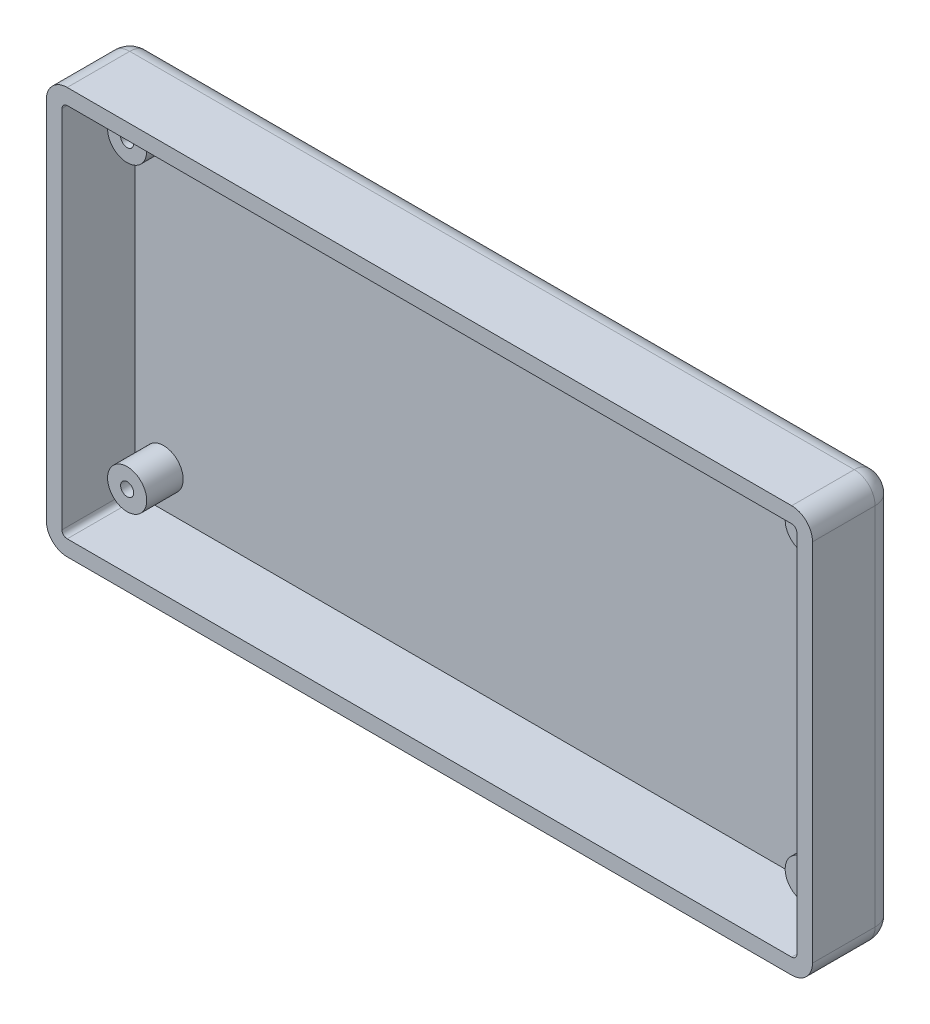
ISO-10303-21;
HEADER;
FILE_DESCRIPTION(('STEP AP214'),'2;1');
FILE_NAME('part.step','',(''),(''),'','','');
FILE_SCHEMA(('AUTOMOTIVE_DESIGN { 1 0 10303 214 1 1 1 1 }'));
ENDSEC;
DATA;
#1=APPLICATION_CONTEXT('core data for automotive mechanical design processes');
#2=APPLICATION_PROTOCOL_DEFINITION('international standard','automotive_design',2000,#1);
#3=PRODUCT_CONTEXT('',#1,'mechanical');
#4=PRODUCT('Part','Part','',(#3));
#5=PRODUCT_RELATED_PRODUCT_CATEGORY('part','',(#4));
#6=PRODUCT_DEFINITION_FORMATION('','',#4);
#7=PRODUCT_DEFINITION_CONTEXT('part definition',#1,'design');
#8=PRODUCT_DEFINITION('design','',#6,#7);
#9=PRODUCT_DEFINITION_SHAPE('','',#8);
#10=(LENGTH_UNIT() NAMED_UNIT(*) SI_UNIT(.MILLI.,.METRE.));
#11=(NAMED_UNIT(*) PLANE_ANGLE_UNIT() SI_UNIT($,.RADIAN.));
#12=(NAMED_UNIT(*) SI_UNIT($,.STERADIAN.) SOLID_ANGLE_UNIT());
#13=UNCERTAINTY_MEASURE_WITH_UNIT(LENGTH_MEASURE(1.E-05),#10,'distance_accuracy_value','');
#14=(GEOMETRIC_REPRESENTATION_CONTEXT(3) GLOBAL_UNCERTAINTY_ASSIGNED_CONTEXT((#13)) GLOBAL_UNIT_ASSIGNED_CONTEXT((#10,
#11,#12)) REPRESENTATION_CONTEXT('',''));
#15=CARTESIAN_POINT('',(0.,0.,0.));
#16=DIRECTION('',(0.,0.,1.));
#17=DIRECTION('',(1.,0.,0.));
#18=AXIS2_PLACEMENT_3D('',#15,#16,#17);
#19=CARTESIAN_POINT('',(0.,0.,2.));
#20=DIRECTION('',(0.,0.,1.));
#21=DIRECTION('',(1.,0.,0.));
#22=AXIS2_PLACEMENT_3D('',#19,#20,#21);
#23=PLANE('',#22);
#24=CARTESIAN_POINT('',(-69.5,35.,2.));
#25=DIRECTION('',(0.,0.,1.));
#26=DIRECTION('',(1.,0.,0.));
#27=AXIS2_PLACEMENT_3D('',#24,#25,#26);
#28=CIRCLE('',#27,1.);
#29=CARTESIAN_POINT('',(-70.5,35.,2.));
#30=VERTEX_POINT('',#29);
#31=CARTESIAN_POINT('',(-69.5,36.,2.));
#32=VERTEX_POINT('',#31);
#33=EDGE_CURVE('E218',#30,#32,#28,.F.);
#34=ORIENTED_EDGE('',*,*,#33,.F.);
#35=DIRECTION('',(0.,1.,0.));
#36=VECTOR('',#35,1.);
#37=CARTESIAN_POINT('',(-70.5,35.,2.));
#38=LINE('',#37,#36);
#39=CARTESIAN_POINT('',(-70.5,-35.,2.));
#40=VERTEX_POINT('',#39);
#41=EDGE_CURVE('E215',#40,#30,#38,.T.);
#42=ORIENTED_EDGE('',*,*,#41,.F.);
#43=CARTESIAN_POINT('',(-69.5,-35.,2.));
#44=DIRECTION('',(0.,0.,1.));
#45=DIRECTION('',(1.,0.,0.));
#46=AXIS2_PLACEMENT_3D('',#43,#44,#45);
#47=CIRCLE('',#46,1.);
#48=CARTESIAN_POINT('',(-69.5,-36.,2.));
#49=VERTEX_POINT('',#48);
#50=EDGE_CURVE('E171',#49,#40,#47,.F.);
#51=ORIENTED_EDGE('',*,*,#50,.F.);
#52=DIRECTION('',(-1.,0.,0.));
#53=VECTOR('',#52,1.);
#54=CARTESIAN_POINT('',(-69.5,-36.,2.));
#55=LINE('',#54,#53);
#56=CARTESIAN_POINT('',(69.5,-36.,2.));
#57=VERTEX_POINT('',#56);
#58=EDGE_CURVE('E399',#57,#49,#55,.T.);
#59=ORIENTED_EDGE('',*,*,#58,.F.);
#60=CARTESIAN_POINT('',(69.5,-35.,2.));
#61=DIRECTION('',(0.,0.,1.));
#62=DIRECTION('',(1.,0.,0.));
#63=AXIS2_PLACEMENT_3D('',#60,#61,#62);
#64=CIRCLE('',#63,0.999999999999994);
#65=CARTESIAN_POINT('',(70.5,-35.,2.));
#66=VERTEX_POINT('',#65);
#67=EDGE_CURVE('E401',#66,#57,#64,.F.);
#68=ORIENTED_EDGE('',*,*,#67,.F.);
#69=DIRECTION('',(0.,-1.,0.));
#70=VECTOR('',#69,1.);
#71=CARTESIAN_POINT('',(70.5,-35.,2.));
#72=LINE('',#71,#70);
#73=CARTESIAN_POINT('',(70.5,35.,2.));
#74=VERTEX_POINT('',#73);
#75=EDGE_CURVE('E403',#74,#66,#72,.T.);
#76=ORIENTED_EDGE('',*,*,#75,.F.);
#77=CARTESIAN_POINT('',(69.5,35.,2.));
#78=DIRECTION('',(0.,0.,1.));
#79=DIRECTION('',(1.,0.,0.));
#80=AXIS2_PLACEMENT_3D('',#77,#78,#79);
#81=CIRCLE('',#80,1.);
#82=CARTESIAN_POINT('',(69.5,36.,2.));
#83=VERTEX_POINT('',#82);
#84=EDGE_CURVE('E405',#83,#74,#81,.F.);
#85=ORIENTED_EDGE('',*,*,#84,.F.);
#86=DIRECTION('',(1.,0.,0.));
#87=VECTOR('',#86,1.);
#88=CARTESIAN_POINT('',(69.5,36.,2.));
#89=LINE('',#88,#87);
#90=EDGE_CURVE('E407',#32,#83,#89,.T.);
#91=ORIENTED_EDGE('',*,*,#90,.F.);
#92=EDGE_LOOP('',(#34,#42,#51,#59,#68,#76,#85,#91));
#93=FACE_BOUND('',#92,.T.);
#94=CARTESIAN_POINT('',(-65.,29.,2.));
#95=DIRECTION('',(0.,0.,1.));
#96=DIRECTION('',(1.,0.,0.));
#97=AXIS2_PLACEMENT_3D('',#94,#95,#96);
#98=CIRCLE('',#97,3.75000000000001);
#99=CARTESIAN_POINT('',(-61.25,29.,2.));
#100=VERTEX_POINT('',#99);
#101=EDGE_CURVE('E387',#100,#100,#98,.T.);
#102=ORIENTED_EDGE('',*,*,#101,.F.);
#103=EDGE_LOOP('',(#102));
#104=FACE_BOUND('',#103,.T.);
#105=CARTESIAN_POINT('',(65.,29.,2.));
#106=DIRECTION('',(0.,0.,1.));
#107=DIRECTION('',(-1.,0.,0.));
#108=AXIS2_PLACEMENT_3D('',#105,#106,#107);
#109=CIRCLE('',#108,3.75000000000001);
#110=CARTESIAN_POINT('',(61.25,29.,2.));
#111=VERTEX_POINT('',#110);
#112=EDGE_CURVE('E393',#111,#111,#109,.T.);
#113=ORIENTED_EDGE('',*,*,#112,.F.);
#114=EDGE_LOOP('',(#113));
#115=FACE_BOUND('',#114,.T.);
#116=CARTESIAN_POINT('',(65.,-29.,2.));
#117=DIRECTION('',(0.,0.,1.));
#118=DIRECTION('',(1.,0.,0.));
#119=AXIS2_PLACEMENT_3D('',#116,#117,#118);
#120=CIRCLE('',#119,3.75000000000001);
#121=CARTESIAN_POINT('',(68.75,-29.,2.));
#122=VERTEX_POINT('',#121);
#123=EDGE_CURVE('E810',#122,#122,#120,.T.);
#124=ORIENTED_EDGE('',*,*,#123,.F.);
#125=EDGE_LOOP('',(#124));
#126=FACE_BOUND('',#125,.T.);
#127=CARTESIAN_POINT('',(-65.,-29.,2.));
#128=DIRECTION('',(0.,0.,1.));
#129=DIRECTION('',(-1.,0.,0.));
#130=AXIS2_PLACEMENT_3D('',#127,#128,#129);
#131=CIRCLE('',#130,3.75000000000001);
#132=CARTESIAN_POINT('',(-68.75,-29.,2.));
#133=VERTEX_POINT('',#132);
#134=EDGE_CURVE('E799',#133,#133,#131,.T.);
#135=ORIENTED_EDGE('',*,*,#134,.F.);
#136=EDGE_LOOP('',(#135));
#137=FACE_BOUND('',#136,.T.);
#138=ADVANCED_FACE('F36',(#93,#104,#115,#126,#137),#23,.T.);
#139=CARTESIAN_POINT('',(73.5,39.,16.));
#140=DIRECTION('',(-1.,0.,0.));
#141=DIRECTION('',(0.,0.,1.));
#142=AXIS2_PLACEMENT_3D('',#139,#140,#141);
#143=PLANE('',#142);
#144=DIRECTION('',(0.,0.,-1.));
#145=VECTOR('',#144,1.);
#146=CARTESIAN_POINT('',(73.5,-35.,16.));
#147=LINE('',#146,#145);
#148=CARTESIAN_POINT('',(73.5,-35.,16.));
#149=VERTEX_POINT('',#148);
#150=CARTESIAN_POINT('',(73.5,-35.,4.));
#151=VERTEX_POINT('',#150);
#152=EDGE_CURVE('E251',#149,#151,#147,.T.);
#153=ORIENTED_EDGE('',*,*,#152,.T.);
#154=DIRECTION('',(0.,1.,0.));
#155=VECTOR('',#154,1.);
#156=CARTESIAN_POINT('',(73.5,39.,4.));
#157=LINE('',#156,#155);
#158=CARTESIAN_POINT('',(73.5,35.,4.));
#159=VERTEX_POINT('',#158);
#160=EDGE_CURVE('E275',#151,#159,#157,.T.);
#161=ORIENTED_EDGE('',*,*,#160,.T.);
#162=DIRECTION('',(0.,0.,-1.));
#163=VECTOR('',#162,1.);
#164=CARTESIAN_POINT('',(73.5,35.,16.));
#165=LINE('',#164,#163);
#166=CARTESIAN_POINT('',(73.5,35.,16.));
#167=VERTEX_POINT('',#166);
#168=EDGE_CURVE('E249',#159,#167,#165,.F.);
#169=ORIENTED_EDGE('',*,*,#168,.T.);
#170=DIRECTION('',(0.,1.,0.));
#171=VECTOR('',#170,1.);
#172=CARTESIAN_POINT('',(73.5,39.,16.));
#173=LINE('',#172,#171);
#174=EDGE_CURVE('E219',#149,#167,#173,.T.);
#175=ORIENTED_EDGE('',*,*,#174,.F.);
#176=EDGE_LOOP('',(#153,#161,#169,#175));
#177=FACE_BOUND('',#176,.T.);
#178=ADVANCED_FACE('F341',(#177),#143,.F.);
#179=CARTESIAN_POINT('',(-73.5,39.,16.));
#180=DIRECTION('',(0.,-1.,0.));
#181=DIRECTION('',(0.,0.,-1.));
#182=AXIS2_PLACEMENT_3D('',#179,#180,#181);
#183=PLANE('',#182);
#184=DIRECTION('',(0.,0.,-1.));
#185=VECTOR('',#184,1.);
#186=CARTESIAN_POINT('',(69.5,39.,16.));
#187=LINE('',#186,#185);
#188=CARTESIAN_POINT('',(69.5,39.,16.));
#189=VERTEX_POINT('',#188);
#190=CARTESIAN_POINT('',(69.5,39.,4.));
#191=VERTEX_POINT('',#190);
#192=EDGE_CURVE('E256',#189,#191,#187,.T.);
#193=ORIENTED_EDGE('',*,*,#192,.T.);
#194=DIRECTION('',(-1.,0.,0.));
#195=VECTOR('',#194,1.);
#196=CARTESIAN_POINT('',(-73.5,39.,4.));
#197=LINE('',#196,#195);
#198=CARTESIAN_POINT('',(-69.5,39.,4.));
#199=VERTEX_POINT('',#198);
#200=EDGE_CURVE('E262',#191,#199,#197,.T.);
#201=ORIENTED_EDGE('',*,*,#200,.T.);
#202=DIRECTION('',(0.,0.,-1.));
#203=VECTOR('',#202,1.);
#204=CARTESIAN_POINT('',(-69.5,39.,16.));
#205=LINE('',#204,#203);
#206=CARTESIAN_POINT('',(-69.5,39.,16.));
#207=VERTEX_POINT('',#206);
#208=EDGE_CURVE('E254',#199,#207,#205,.F.);
#209=ORIENTED_EDGE('',*,*,#208,.T.);
#210=DIRECTION('',(-1.,0.,0.));
#211=VECTOR('',#210,1.);
#212=CARTESIAN_POINT('',(-73.5,39.,16.));
#213=LINE('',#212,#211);
#214=EDGE_CURVE('E222',#189,#207,#213,.T.);
#215=ORIENTED_EDGE('',*,*,#214,.F.);
#216=EDGE_LOOP('',(#193,#201,#209,#215));
#217=FACE_BOUND('',#216,.T.);
#218=ADVANCED_FACE('F346',(#217),#183,.F.);
#219=CARTESIAN_POINT('',(-73.5,39.,16.));
#220=DIRECTION('',(1.,0.,0.));
#221=DIRECTION('',(0.,1.,0.));
#222=AXIS2_PLACEMENT_3D('',#219,#220,#221);
#223=PLANE('',#222);
#224=DIRECTION('',(0.,0.,-1.));
#225=VECTOR('',#224,1.);
#226=CARTESIAN_POINT('',(-73.5,35.,16.));
#227=LINE('',#226,#225);
#228=CARTESIAN_POINT('',(-73.5,35.,16.));
#229=VERTEX_POINT('',#228);
#230=CARTESIAN_POINT('',(-73.5,35.,4.));
#231=VERTEX_POINT('',#230);
#232=EDGE_CURVE('E237',#229,#231,#227,.T.);
#233=ORIENTED_EDGE('',*,*,#232,.T.);
#234=DIRECTION('',(0.,-1.,0.));
#235=VECTOR('',#234,1.);
#236=CARTESIAN_POINT('',(-73.5,39.,4.));
#237=LINE('',#236,#235);
#238=CARTESIAN_POINT('',(-73.5,-35.,4.));
#239=VERTEX_POINT('',#238);
#240=EDGE_CURVE('E59',#231,#239,#237,.T.);
#241=ORIENTED_EDGE('',*,*,#240,.T.);
#242=DIRECTION('',(0.,0.,-1.));
#243=VECTOR('',#242,1.);
#244=CARTESIAN_POINT('',(-73.5,-35.,16.));
#245=LINE('',#244,#243);
#246=CARTESIAN_POINT('',(-73.5,-35.,16.));
#247=VERTEX_POINT('',#246);
#248=EDGE_CURVE('E239',#239,#247,#245,.F.);
#249=ORIENTED_EDGE('',*,*,#248,.T.);
#250=DIRECTION('',(0.,-1.,0.));
#251=VECTOR('',#250,1.);
#252=CARTESIAN_POINT('',(-73.5,39.,16.));
#253=LINE('',#252,#251);
#254=EDGE_CURVE('E226',#229,#247,#253,.T.);
#255=ORIENTED_EDGE('',*,*,#254,.F.);
#256=EDGE_LOOP('',(#233,#241,#249,#255));
#257=FACE_BOUND('',#256,.T.);
#258=ADVANCED_FACE('F456',(#257),#223,.F.);
#259=CARTESIAN_POINT('',(-73.5,-39.,16.));
#260=DIRECTION('',(0.,1.,0.));
#261=DIRECTION('',(0.,0.,1.));
#262=AXIS2_PLACEMENT_3D('',#259,#260,#261);
#263=PLANE('',#262);
#264=DIRECTION('',(0.,0.,-1.));
#265=VECTOR('',#264,1.);
#266=CARTESIAN_POINT('',(-69.5,-39.,16.));
#267=LINE('',#266,#265);
#268=CARTESIAN_POINT('',(-69.5,-39.,16.));
#269=VERTEX_POINT('',#268);
#270=CARTESIAN_POINT('',(-69.5,-39.,4.));
#271=VERTEX_POINT('',#270);
#272=EDGE_CURVE('E234',#269,#271,#267,.T.);
#273=ORIENTED_EDGE('',*,*,#272,.T.);
#274=DIRECTION('',(1.,0.,0.));
#275=VECTOR('',#274,1.);
#276=CARTESIAN_POINT('',(-73.5,-39.,4.));
#277=LINE('',#276,#275);
#278=CARTESIAN_POINT('',(69.5,-39.,4.));
#279=VERTEX_POINT('',#278);
#280=EDGE_CURVE('E279',#271,#279,#277,.T.);
#281=ORIENTED_EDGE('',*,*,#280,.T.);
#282=DIRECTION('',(0.,0.,-1.));
#283=VECTOR('',#282,1.);
#284=CARTESIAN_POINT('',(69.5,-39.,16.));
#285=LINE('',#284,#283);
#286=CARTESIAN_POINT('',(69.5,-39.,16.));
#287=VERTEX_POINT('',#286);
#288=EDGE_CURVE('E232',#279,#287,#285,.F.);
#289=ORIENTED_EDGE('',*,*,#288,.T.);
#290=DIRECTION('',(1.,0.,0.));
#291=VECTOR('',#290,1.);
#292=CARTESIAN_POINT('',(-73.5,-39.,16.));
#293=LINE('',#292,#291);
#294=EDGE_CURVE('E229',#269,#287,#293,.T.);
#295=ORIENTED_EDGE('',*,*,#294,.F.);
#296=EDGE_LOOP('',(#273,#281,#289,#295));
#297=FACE_BOUND('',#296,.T.);
#298=ADVANCED_FACE('F449',(#297),#263,.F.);
#299=CARTESIAN_POINT('',(0.,0.,16.));
#300=DIRECTION('',(0.,0.,1.));
#301=DIRECTION('',(1.,0.,0.));
#302=AXIS2_PLACEMENT_3D('',#299,#300,#301);
#303=PLANE('',#302);
#304=CARTESIAN_POINT('',(-69.5,35.,16.));
#305=DIRECTION('',(0.,0.,1.));
#306=DIRECTION('',(1.,0.,0.));
#307=AXIS2_PLACEMENT_3D('',#304,#305,#306);
#308=CIRCLE('',#307,1.);
#309=CARTESIAN_POINT('',(-69.5,36.,16.));
#310=VERTEX_POINT('',#309);
#311=CARTESIAN_POINT('',(-70.5,35.,16.));
#312=VERTEX_POINT('',#311);
#313=EDGE_CURVE('E51',#310,#312,#308,.T.);
#314=ORIENTED_EDGE('',*,*,#313,.F.);
#315=DIRECTION('',(-1.,0.,0.));
#316=VECTOR('',#315,1.);
#317=CARTESIAN_POINT('',(69.5,36.,16.));
#318=LINE('',#317,#316);
#319=CARTESIAN_POINT('',(69.5,36.,16.));
#320=VERTEX_POINT('',#319);
#321=EDGE_CURVE('E200',#320,#310,#318,.T.);
#322=ORIENTED_EDGE('',*,*,#321,.F.);
#323=CARTESIAN_POINT('',(69.5,35.,16.));
#324=DIRECTION('',(0.,0.,1.));
#325=DIRECTION('',(1.,0.,0.));
#326=AXIS2_PLACEMENT_3D('',#323,#324,#325);
#327=CIRCLE('',#326,1.);
#328=CARTESIAN_POINT('',(70.5,35.,16.));
#329=VERTEX_POINT('',#328);
#330=EDGE_CURVE('E197',#329,#320,#327,.T.);
#331=ORIENTED_EDGE('',*,*,#330,.F.);
#332=DIRECTION('',(0.,1.,0.));
#333=VECTOR('',#332,1.);
#334=CARTESIAN_POINT('',(70.5,-35.,16.));
#335=LINE('',#334,#333);
#336=CARTESIAN_POINT('',(70.5,-35.,16.));
#337=VERTEX_POINT('',#336);
#338=EDGE_CURVE('E194',#337,#329,#335,.T.);
#339=ORIENTED_EDGE('',*,*,#338,.F.);
#340=CARTESIAN_POINT('',(69.5,-35.,16.));
#341=DIRECTION('',(0.,0.,1.));
#342=DIRECTION('',(1.,0.,0.));
#343=AXIS2_PLACEMENT_3D('',#340,#341,#342);
#344=CIRCLE('',#343,0.999999999999994);
#345=CARTESIAN_POINT('',(69.5,-36.,16.));
#346=VERTEX_POINT('',#345);
#347=EDGE_CURVE('E188',#346,#337,#344,.T.);
#348=ORIENTED_EDGE('',*,*,#347,.F.);
#349=DIRECTION('',(1.,0.,0.));
#350=VECTOR('',#349,1.);
#351=CARTESIAN_POINT('',(-69.5,-36.,16.));
#352=LINE('',#351,#350);
#353=CARTESIAN_POINT('',(-69.5,-36.,16.));
#354=VERTEX_POINT('',#353);
#355=EDGE_CURVE('E186',#354,#346,#352,.T.);
#356=ORIENTED_EDGE('',*,*,#355,.F.);
#357=CARTESIAN_POINT('',(-69.5,-35.,16.));
#358=DIRECTION('',(0.,0.,1.));
#359=DIRECTION('',(1.,0.,0.));
#360=AXIS2_PLACEMENT_3D('',#357,#358,#359);
#361=CIRCLE('',#360,1.);
#362=CARTESIAN_POINT('',(-70.5,-35.,16.));
#363=VERTEX_POINT('',#362);
#364=EDGE_CURVE('E168',#363,#354,#361,.T.);
#365=ORIENTED_EDGE('',*,*,#364,.F.);
#366=DIRECTION('',(0.,-1.,0.));
#367=VECTOR('',#366,1.);
#368=CARTESIAN_POINT('',(-70.5,35.,16.));
#369=LINE('',#368,#367);
#370=EDGE_CURVE('E178',#312,#363,#369,.T.);
#371=ORIENTED_EDGE('',*,*,#370,.F.);
#372=EDGE_LOOP('',(#314,#322,#331,#339,#348,#356,#365,#371));
#373=FACE_BOUND('',#372,.T.);
#374=ORIENTED_EDGE('',*,*,#254,.T.);
#375=CARTESIAN_POINT('',(-69.5,-35.,16.));
#376=DIRECTION('',(0.,0.,1.));
#377=DIRECTION('',(1.,0.,0.));
#378=AXIS2_PLACEMENT_3D('',#375,#376,#377);
#379=CIRCLE('',#378,4.);
#380=EDGE_CURVE('E247',#247,#269,#379,.T.);
#381=ORIENTED_EDGE('',*,*,#380,.T.);
#382=ORIENTED_EDGE('',*,*,#294,.T.);
#383=CARTESIAN_POINT('',(69.5,-35.,16.));
#384=DIRECTION('',(0.,0.,1.));
#385=DIRECTION('',(1.,0.,0.));
#386=AXIS2_PLACEMENT_3D('',#383,#384,#385);
#387=CIRCLE('',#386,4.);
#388=EDGE_CURVE('E245',#287,#149,#387,.T.);
#389=ORIENTED_EDGE('',*,*,#388,.T.);
#390=ORIENTED_EDGE('',*,*,#174,.T.);
#391=CARTESIAN_POINT('',(69.5,35.,16.));
#392=DIRECTION('',(0.,0.,1.));
#393=DIRECTION('',(1.,0.,0.));
#394=AXIS2_PLACEMENT_3D('',#391,#392,#393);
#395=CIRCLE('',#394,4.);
#396=EDGE_CURVE('E243',#167,#189,#395,.T.);
#397=ORIENTED_EDGE('',*,*,#396,.T.);
#398=ORIENTED_EDGE('',*,*,#214,.T.);
#399=CARTESIAN_POINT('',(-69.5,35.,16.));
#400=DIRECTION('',(0.,0.,1.));
#401=DIRECTION('',(1.,0.,0.));
#402=AXIS2_PLACEMENT_3D('',#399,#400,#401);
#403=CIRCLE('',#402,4.);
#404=EDGE_CURVE('E241',#207,#229,#403,.T.);
#405=ORIENTED_EDGE('',*,*,#404,.T.);
#406=EDGE_LOOP('',(#374,#381,#382,#389,#390,#397,#398,#405));
#407=FACE_BOUND('',#406,.T.);
#408=ADVANCED_FACE('F182',(#373,#407),#303,.T.);
#409=CARTESIAN_POINT('',(0.,0.,0.));
#410=DIRECTION('',(0.,0.,1.));
#411=DIRECTION('',(1.,0.,0.));
#412=AXIS2_PLACEMENT_3D('',#409,#410,#411);
#413=PLANE('',#412);
#414=DIRECTION('',(0.,-1.,0.));
#415=VECTOR('',#414,1.);
#416=CARTESIAN_POINT('',(-69.5,0.,0.));
#417=LINE('',#416,#415);
#418=CARTESIAN_POINT('',(-69.5,-35.,0.));
#419=VERTEX_POINT('',#418);
#420=CARTESIAN_POINT('',(-69.5,35.,0.));
#421=VERTEX_POINT('',#420);
#422=EDGE_CURVE('E264',#419,#421,#417,.F.);
#423=ORIENTED_EDGE('',*,*,#422,.T.);
#424=DIRECTION('',(-1.,0.,0.));
#425=VECTOR('',#424,1.);
#426=CARTESIAN_POINT('',(0.,35.,0.));
#427=LINE('',#426,#425);
#428=CARTESIAN_POINT('',(69.5,35.,0.));
#429=VERTEX_POINT('',#428);
#430=EDGE_CURVE('E270',#421,#429,#427,.F.);
#431=ORIENTED_EDGE('',*,*,#430,.T.);
#432=DIRECTION('',(0.,1.,0.));
#433=VECTOR('',#432,1.);
#434=CARTESIAN_POINT('',(69.5,0.,0.));
#435=LINE('',#434,#433);
#436=CARTESIAN_POINT('',(69.5,-35.,0.));
#437=VERTEX_POINT('',#436);
#438=EDGE_CURVE('E268',#429,#437,#435,.F.);
#439=ORIENTED_EDGE('',*,*,#438,.T.);
#440=DIRECTION('',(1.,0.,0.));
#441=VECTOR('',#440,1.);
#442=CARTESIAN_POINT('',(0.,-35.,0.));
#443=LINE('',#442,#441);
#444=EDGE_CURVE('E266',#437,#419,#443,.F.);
#445=ORIENTED_EDGE('',*,*,#444,.T.);
#446=EDGE_LOOP('',(#423,#431,#439,#445));
#447=FACE_BOUND('',#446,.T.);
#448=ADVANCED_FACE('F448',(#447),#413,.F.);
#449=CARTESIAN_POINT('',(-69.5,-35.,16.));
#450=DIRECTION('',(0.,0.,-1.));
#451=DIRECTION('',(-1.,0.,0.));
#452=AXIS2_PLACEMENT_3D('',#449,#450,#451);
#453=CYLINDRICAL_SURFACE('',#452,4.);
#454=ORIENTED_EDGE('',*,*,#248,.F.);
#455=CARTESIAN_POINT('',(-69.5,-35.,4.));
#456=DIRECTION('',(0.,0.,-1.));
#457=DIRECTION('',(-1.,0.,0.));
#458=AXIS2_PLACEMENT_3D('',#455,#456,#457);
#459=CIRCLE('',#458,4.);
#460=EDGE_CURVE('E281',#239,#271,#459,.F.);
#461=ORIENTED_EDGE('',*,*,#460,.T.);
#462=ORIENTED_EDGE('',*,*,#272,.F.);
#463=ORIENTED_EDGE('',*,*,#380,.F.);
#464=EDGE_LOOP('',(#454,#461,#462,#463));
#465=FACE_BOUND('',#464,.T.);
#466=ADVANCED_FACE('F452',(#465),#453,.T.);
#467=CARTESIAN_POINT('',(69.5,-35.,16.));
#468=DIRECTION('',(0.,0.,-1.));
#469=DIRECTION('',(-1.,0.,0.));
#470=AXIS2_PLACEMENT_3D('',#467,#468,#469);
#471=CYLINDRICAL_SURFACE('',#470,4.);
#472=ORIENTED_EDGE('',*,*,#288,.F.);
#473=CARTESIAN_POINT('',(69.5,-35.,4.));
#474=DIRECTION('',(0.,0.,-1.));
#475=DIRECTION('',(-1.,0.,0.));
#476=AXIS2_PLACEMENT_3D('',#473,#474,#475);
#477=CIRCLE('',#476,4.);
#478=EDGE_CURVE('E277',#279,#151,#477,.F.);
#479=ORIENTED_EDGE('',*,*,#478,.T.);
#480=ORIENTED_EDGE('',*,*,#152,.F.);
#481=ORIENTED_EDGE('',*,*,#388,.F.);
#482=EDGE_LOOP('',(#472,#479,#480,#481));
#483=FACE_BOUND('',#482,.T.);
#484=ADVANCED_FACE('F465',(#483),#471,.T.);
#485=CARTESIAN_POINT('',(69.5,35.,16.));
#486=DIRECTION('',(0.,0.,-1.));
#487=DIRECTION('',(-1.,0.,0.));
#488=AXIS2_PLACEMENT_3D('',#485,#486,#487);
#489=CYLINDRICAL_SURFACE('',#488,4.);
#490=ORIENTED_EDGE('',*,*,#168,.F.);
#491=CARTESIAN_POINT('',(69.5,35.,4.));
#492=DIRECTION('',(0.,0.,-1.));
#493=DIRECTION('',(-1.,0.,0.));
#494=AXIS2_PLACEMENT_3D('',#491,#492,#493);
#495=CIRCLE('',#494,4.);
#496=EDGE_CURVE('E273',#159,#191,#495,.F.);
#497=ORIENTED_EDGE('',*,*,#496,.T.);
#498=ORIENTED_EDGE('',*,*,#192,.F.);
#499=ORIENTED_EDGE('',*,*,#396,.F.);
#500=EDGE_LOOP('',(#490,#497,#498,#499));
#501=FACE_BOUND('',#500,.T.);
#502=ADVANCED_FACE('F469',(#501),#489,.T.);
#503=CARTESIAN_POINT('',(-69.5,35.,16.));
#504=DIRECTION('',(0.,0.,-1.));
#505=DIRECTION('',(-1.,0.,0.));
#506=AXIS2_PLACEMENT_3D('',#503,#504,#505);
#507=CYLINDRICAL_SURFACE('',#506,4.);
#508=ORIENTED_EDGE('',*,*,#208,.F.);
#509=CARTESIAN_POINT('',(-69.5,35.,4.));
#510=DIRECTION('',(0.,0.,-1.));
#511=DIRECTION('',(-1.,0.,0.));
#512=AXIS2_PLACEMENT_3D('',#509,#510,#511);
#513=CIRCLE('',#512,4.);
#514=EDGE_CURVE('E259',#199,#231,#513,.F.);
#515=ORIENTED_EDGE('',*,*,#514,.T.);
#516=ORIENTED_EDGE('',*,*,#232,.F.);
#517=ORIENTED_EDGE('',*,*,#404,.F.);
#518=EDGE_LOOP('',(#508,#515,#516,#517));
#519=FACE_BOUND('',#518,.T.);
#520=ADVANCED_FACE('F473',(#519),#507,.T.);
#521=CARTESIAN_POINT('',(69.5,-35.,4.));
#522=DIRECTION('',(0.,0.,1.));
#523=DIRECTION('',(1.,0.,0.));
#524=AXIS2_PLACEMENT_3D('',#521,#522,#523);
#525=SPHERICAL_SURFACE('',#524,4.);
#526=CARTESIAN_POINT('',(69.5,-35.,4.));
#527=DIRECTION('',(0.,1.,0.));
#528=DIRECTION('',(0.,0.,1.));
#529=AXIS2_PLACEMENT_3D('',#526,#527,#528);
#530=CIRCLE('',#529,4.);
#531=EDGE_CURVE('E300',#151,#437,#530,.T.);
#532=ORIENTED_EDGE('',*,*,#531,.F.);
#533=ORIENTED_EDGE('',*,*,#478,.F.);
#534=CARTESIAN_POINT('',(69.5,-35.,4.));
#535=DIRECTION('',(-1.,0.,0.));
#536=DIRECTION('',(0.,0.,1.));
#537=AXIS2_PLACEMENT_3D('',#534,#535,#536);
#538=CIRCLE('',#537,4.);
#539=EDGE_CURVE('E223',#437,#279,#538,.T.);
#540=ORIENTED_EDGE('',*,*,#539,.F.);
#541=EDGE_LOOP('',(#532,#533,#540));
#542=FACE_BOUND('',#541,.T.);
#543=ADVANCED_FACE('F38',(#542),#525,.T.);
#544=CARTESIAN_POINT('',(-73.5,-35.,4.));
#545=DIRECTION('',(1.,0.,0.));
#546=DIRECTION('',(0.,0.,-1.));
#547=AXIS2_PLACEMENT_3D('',#544,#545,#546);
#548=CYLINDRICAL_SURFACE('',#547,4.);
#549=ORIENTED_EDGE('',*,*,#539,.T.);
#550=ORIENTED_EDGE('',*,*,#280,.F.);
#551=CARTESIAN_POINT('',(-69.5,-35.,4.));
#552=DIRECTION('',(-1.,0.,0.));
#553=DIRECTION('',(0.,0.,1.));
#554=AXIS2_PLACEMENT_3D('',#551,#552,#553);
#555=CIRCLE('',#554,4.);
#556=EDGE_CURVE('E297',#419,#271,#555,.T.);
#557=ORIENTED_EDGE('',*,*,#556,.F.);
#558=ORIENTED_EDGE('',*,*,#444,.F.);
#559=EDGE_LOOP('',(#549,#550,#557,#558));
#560=FACE_BOUND('',#559,.T.);
#561=ADVANCED_FACE('F499',(#560),#548,.T.);
#562=CARTESIAN_POINT('',(69.5,39.,4.));
#563=DIRECTION('',(0.,1.,0.));
#564=DIRECTION('',(0.,0.,1.));
#565=AXIS2_PLACEMENT_3D('',#562,#563,#564);
#566=CYLINDRICAL_SURFACE('',#565,4.);
#567=ORIENTED_EDGE('',*,*,#531,.T.);
#568=ORIENTED_EDGE('',*,*,#438,.F.);
#569=CARTESIAN_POINT('',(69.5,35.,4.));
#570=DIRECTION('',(0.,1.,0.));
#571=DIRECTION('',(0.,0.,1.));
#572=AXIS2_PLACEMENT_3D('',#569,#570,#571);
#573=CIRCLE('',#572,4.);
#574=EDGE_CURVE('E294',#159,#429,#573,.T.);
#575=ORIENTED_EDGE('',*,*,#574,.F.);
#576=ORIENTED_EDGE('',*,*,#160,.F.);
#577=EDGE_LOOP('',(#567,#568,#575,#576));
#578=FACE_BOUND('',#577,.T.);
#579=ADVANCED_FACE('F496',(#578),#566,.T.);
#580=CARTESIAN_POINT('',(-69.5,-35.,4.));
#581=DIRECTION('',(0.,0.,1.));
#582=DIRECTION('',(1.,0.,0.));
#583=AXIS2_PLACEMENT_3D('',#580,#581,#582);
#584=SPHERICAL_SURFACE('',#583,4.);
#585=ORIENTED_EDGE('',*,*,#556,.T.);
#586=ORIENTED_EDGE('',*,*,#460,.F.);
#587=CARTESIAN_POINT('',(-69.5,-35.,4.));
#588=DIRECTION('',(0.,1.,0.));
#589=DIRECTION('',(-1.,0.,0.));
#590=AXIS2_PLACEMENT_3D('',#587,#588,#589);
#591=CIRCLE('',#590,4.);
#592=EDGE_CURVE('E291',#419,#239,#591,.T.);
#593=ORIENTED_EDGE('',*,*,#592,.F.);
#594=EDGE_LOOP('',(#585,#586,#593));
#595=FACE_BOUND('',#594,.T.);
#596=ADVANCED_FACE('F492',(#595),#584,.T.);
#597=CARTESIAN_POINT('',(69.5,35.,4.));
#598=DIRECTION('',(0.,0.,1.));
#599=DIRECTION('',(1.,0.,0.));
#600=AXIS2_PLACEMENT_3D('',#597,#598,#599);
#601=SPHERICAL_SURFACE('',#600,4.);
#602=ORIENTED_EDGE('',*,*,#496,.F.);
#603=ORIENTED_EDGE('',*,*,#574,.T.);
#604=CARTESIAN_POINT('',(69.5,35.,4.));
#605=DIRECTION('',(-1.,0.,0.));
#606=DIRECTION('',(0.,0.,1.));
#607=AXIS2_PLACEMENT_3D('',#604,#605,#606);
#608=CIRCLE('',#607,4.);
#609=EDGE_CURVE('E289',#191,#429,#608,.T.);
#610=ORIENTED_EDGE('',*,*,#609,.F.);
#611=EDGE_LOOP('',(#602,#603,#610));
#612=FACE_BOUND('',#611,.T.);
#613=ADVANCED_FACE('F488',(#612),#601,.T.);
#614=CARTESIAN_POINT('',(-69.5,39.,4.));
#615=DIRECTION('',(0.,-1.,0.));
#616=DIRECTION('',(1.,0.,0.));
#617=AXIS2_PLACEMENT_3D('',#614,#615,#616);
#618=CYLINDRICAL_SURFACE('',#617,4.);
#619=ORIENTED_EDGE('',*,*,#592,.T.);
#620=ORIENTED_EDGE('',*,*,#240,.F.);
#621=CARTESIAN_POINT('',(-69.5,35.,4.));
#622=DIRECTION('',(0.,1.,0.));
#623=DIRECTION('',(0.,0.,1.));
#624=AXIS2_PLACEMENT_3D('',#621,#622,#623);
#625=CIRCLE('',#624,4.);
#626=EDGE_CURVE('E287',#421,#231,#625,.T.);
#627=ORIENTED_EDGE('',*,*,#626,.F.);
#628=ORIENTED_EDGE('',*,*,#422,.F.);
#629=EDGE_LOOP('',(#619,#620,#627,#628));
#630=FACE_BOUND('',#629,.T.);
#631=ADVANCED_FACE('F484',(#630),#618,.T.);
#632=CARTESIAN_POINT('',(-73.5,35.,4.));
#633=DIRECTION('',(-1.,0.,0.));
#634=DIRECTION('',(0.,0.,1.));
#635=AXIS2_PLACEMENT_3D('',#632,#633,#634);
#636=CYLINDRICAL_SURFACE('',#635,4.);
#637=ORIENTED_EDGE('',*,*,#609,.T.);
#638=ORIENTED_EDGE('',*,*,#430,.F.);
#639=CARTESIAN_POINT('',(-69.5,35.,4.));
#640=DIRECTION('',(-1.,0.,0.));
#641=DIRECTION('',(0.,0.,1.));
#642=AXIS2_PLACEMENT_3D('',#639,#640,#641);
#643=CIRCLE('',#642,4.);
#644=EDGE_CURVE('E217',#199,#421,#643,.T.);
#645=ORIENTED_EDGE('',*,*,#644,.F.);
#646=ORIENTED_EDGE('',*,*,#200,.F.);
#647=EDGE_LOOP('',(#637,#638,#645,#646));
#648=FACE_BOUND('',#647,.T.);
#649=ADVANCED_FACE('F480',(#648),#636,.T.);
#650=CARTESIAN_POINT('',(-69.5,35.,4.));
#651=DIRECTION('',(0.,0.,1.));
#652=DIRECTION('',(1.,0.,0.));
#653=AXIS2_PLACEMENT_3D('',#650,#651,#652);
#654=SPHERICAL_SURFACE('',#653,4.);
#655=ORIENTED_EDGE('',*,*,#626,.T.);
#656=ORIENTED_EDGE('',*,*,#514,.F.);
#657=ORIENTED_EDGE('',*,*,#644,.T.);
#658=EDGE_LOOP('',(#655,#656,#657));
#659=FACE_BOUND('',#658,.T.);
#660=ADVANCED_FACE('F445',(#659),#654,.T.);
#661=CARTESIAN_POINT('',(-69.5,35.,-160.319297623505));
#662=DIRECTION('',(0.,0.,1.));
#663=DIRECTION('',(1.,0.,0.));
#664=AXIS2_PLACEMENT_3D('',#661,#662,#663);
#665=CYLINDRICAL_SURFACE('',#664,1.);
#666=ORIENTED_EDGE('',*,*,#33,.T.);
#667=DIRECTION('',(0.,0.,1.));
#668=VECTOR('',#667,1.);
#669=CARTESIAN_POINT('',(-69.5,36.,-160.319297623505));
#670=LINE('',#669,#668);
#671=EDGE_CURVE('E203',#32,#310,#670,.T.);
#672=ORIENTED_EDGE('',*,*,#671,.T.);
#673=ORIENTED_EDGE('',*,*,#313,.T.);
#674=DIRECTION('',(0.,0.,1.));
#675=VECTOR('',#674,1.);
#676=CARTESIAN_POINT('',(-70.5,35.,-160.319297623505));
#677=LINE('',#676,#675);
#678=EDGE_CURVE('E175',#30,#312,#677,.T.);
#679=ORIENTED_EDGE('',*,*,#678,.F.);
#680=EDGE_LOOP('',(#666,#672,#673,#679));
#681=FACE_BOUND('',#680,.T.);
#682=ADVANCED_FACE('F410',(#681),#665,.F.);
#683=CARTESIAN_POINT('',(69.5,36.,-160.319297623505));
#684=DIRECTION('',(0.,1.,0.));
#685=DIRECTION('',(0.,0.,1.));
#686=AXIS2_PLACEMENT_3D('',#683,#684,#685);
#687=PLANE('',#686);
#688=ORIENTED_EDGE('',*,*,#90,.T.);
#689=DIRECTION('',(0.,0.,1.));
#690=VECTOR('',#689,1.);
#691=CARTESIAN_POINT('',(69.5,36.,-160.319297623505));
#692=LINE('',#691,#690);
#693=EDGE_CURVE('E205',#83,#320,#692,.T.);
#694=ORIENTED_EDGE('',*,*,#693,.T.);
#695=ORIENTED_EDGE('',*,*,#321,.T.);
#696=ORIENTED_EDGE('',*,*,#671,.F.);
#697=EDGE_LOOP('',(#688,#694,#695,#696));
#698=FACE_BOUND('',#697,.T.);
#699=ADVANCED_FACE('F416',(#698),#687,.F.);
#700=CARTESIAN_POINT('',(69.5,35.,-160.319297623505));
#701=DIRECTION('',(0.,0.,1.));
#702=DIRECTION('',(1.,0.,0.));
#703=AXIS2_PLACEMENT_3D('',#700,#701,#702);
#704=CYLINDRICAL_SURFACE('',#703,1.);
#705=ORIENTED_EDGE('',*,*,#84,.T.);
#706=DIRECTION('',(0.,0.,1.));
#707=VECTOR('',#706,1.);
#708=CARTESIAN_POINT('',(70.5,35.,-160.319297623505));
#709=LINE('',#708,#707);
#710=EDGE_CURVE('E207',#74,#329,#709,.T.);
#711=ORIENTED_EDGE('',*,*,#710,.T.);
#712=ORIENTED_EDGE('',*,*,#330,.T.);
#713=ORIENTED_EDGE('',*,*,#693,.F.);
#714=EDGE_LOOP('',(#705,#711,#712,#713));
#715=FACE_BOUND('',#714,.T.);
#716=ADVANCED_FACE('F421',(#715),#704,.F.);
#717=CARTESIAN_POINT('',(70.5,-35.,-160.319297623505));
#718=DIRECTION('',(1.,0.,0.));
#719=DIRECTION('',(0.,0.,-1.));
#720=AXIS2_PLACEMENT_3D('',#717,#718,#719);
#721=PLANE('',#720);
#722=ORIENTED_EDGE('',*,*,#75,.T.);
#723=DIRECTION('',(0.,0.,1.));
#724=VECTOR('',#723,1.);
#725=CARTESIAN_POINT('',(70.5,-35.,-160.319297623505));
#726=LINE('',#725,#724);
#727=EDGE_CURVE('E209',#66,#337,#726,.T.);
#728=ORIENTED_EDGE('',*,*,#727,.T.);
#729=ORIENTED_EDGE('',*,*,#338,.T.);
#730=ORIENTED_EDGE('',*,*,#710,.F.);
#731=EDGE_LOOP('',(#722,#728,#729,#730));
#732=FACE_BOUND('',#731,.T.);
#733=ADVANCED_FACE('F424',(#732),#721,.F.);
#734=CARTESIAN_POINT('',(69.5,-35.,-160.319297623505));
#735=DIRECTION('',(0.,0.,1.));
#736=DIRECTION('',(1.,0.,0.));
#737=AXIS2_PLACEMENT_3D('',#734,#735,#736);
#738=CYLINDRICAL_SURFACE('',#737,0.999999999999994);
#739=ORIENTED_EDGE('',*,*,#67,.T.);
#740=DIRECTION('',(0.,0.,1.));
#741=VECTOR('',#740,1.);
#742=CARTESIAN_POINT('',(69.5,-36.,-160.319297623505));
#743=LINE('',#742,#741);
#744=EDGE_CURVE('E211',#57,#346,#743,.T.);
#745=ORIENTED_EDGE('',*,*,#744,.T.);
#746=ORIENTED_EDGE('',*,*,#347,.T.);
#747=ORIENTED_EDGE('',*,*,#727,.F.);
#748=EDGE_LOOP('',(#739,#745,#746,#747));
#749=FACE_BOUND('',#748,.T.);
#750=ADVANCED_FACE('F428',(#749),#738,.F.);
#751=CARTESIAN_POINT('',(-69.5,-36.,-160.319297623505));
#752=DIRECTION('',(0.,-1.,0.));
#753=DIRECTION('',(1.,0.,0.));
#754=AXIS2_PLACEMENT_3D('',#751,#752,#753);
#755=PLANE('',#754);
#756=ORIENTED_EDGE('',*,*,#58,.T.);
#757=DIRECTION('',(0.,0.,1.));
#758=VECTOR('',#757,1.);
#759=CARTESIAN_POINT('',(-69.5,-36.,-160.319297623505));
#760=LINE('',#759,#758);
#761=EDGE_CURVE('E174',#49,#354,#760,.T.);
#762=ORIENTED_EDGE('',*,*,#761,.T.);
#763=ORIENTED_EDGE('',*,*,#355,.T.);
#764=ORIENTED_EDGE('',*,*,#744,.F.);
#765=EDGE_LOOP('',(#756,#762,#763,#764));
#766=FACE_BOUND('',#765,.T.);
#767=ADVANCED_FACE('F432',(#766),#755,.F.);
#768=CARTESIAN_POINT('',(-69.5,-35.,-160.319297623505));
#769=DIRECTION('',(0.,0.,1.));
#770=DIRECTION('',(1.,0.,0.));
#771=AXIS2_PLACEMENT_3D('',#768,#769,#770);
#772=CYLINDRICAL_SURFACE('',#771,1.);
#773=ORIENTED_EDGE('',*,*,#50,.T.);
#774=DIRECTION('',(0.,0.,1.));
#775=VECTOR('',#774,1.);
#776=CARTESIAN_POINT('',(-70.5,-35.,-160.319297623505));
#777=LINE('',#776,#775);
#778=EDGE_CURVE('E163',#40,#363,#777,.T.);
#779=ORIENTED_EDGE('',*,*,#778,.T.);
#780=ORIENTED_EDGE('',*,*,#364,.T.);
#781=ORIENTED_EDGE('',*,*,#761,.F.);
#782=EDGE_LOOP('',(#773,#779,#780,#781));
#783=FACE_BOUND('',#782,.T.);
#784=ADVANCED_FACE('F165',(#783),#772,.F.);
#785=CARTESIAN_POINT('',(-70.5,35.,-160.319297623505));
#786=DIRECTION('',(-1.,0.,0.));
#787=DIRECTION('',(0.,-1.,0.));
#788=AXIS2_PLACEMENT_3D('',#785,#786,#787);
#789=PLANE('',#788);
#790=ORIENTED_EDGE('',*,*,#41,.T.);
#791=ORIENTED_EDGE('',*,*,#678,.T.);
#792=ORIENTED_EDGE('',*,*,#370,.T.);
#793=ORIENTED_EDGE('',*,*,#778,.F.);
#794=EDGE_LOOP('',(#790,#791,#792,#793));
#795=FACE_BOUND('',#794,.T.);
#796=ADVANCED_FACE('F179',(#795),#789,.F.);
#797=CARTESIAN_POINT('',(-65.,29.,9.));
#798=DIRECTION('',(0.,0.,1.));
#799=DIRECTION('',(1.,0.,0.));
#800=AXIS2_PLACEMENT_3D('',#797,#798,#799);
#801=PLANE('',#800);
#802=CARTESIAN_POINT('',(-65.,29.,9.));
#803=DIRECTION('',(0.,0.,1.));
#804=DIRECTION('',(1.,0.,0.));
#805=AXIS2_PLACEMENT_3D('',#802,#803,#804);
#806=CIRCLE('',#805,3.75000000000001);
#807=CARTESIAN_POINT('',(-61.25,29.,9.));
#808=VERTEX_POINT('',#807);
#809=EDGE_CURVE('E384',#808,#808,#806,.T.);
#810=ORIENTED_EDGE('',*,*,#809,.T.);
#811=EDGE_LOOP('',(#810));
#812=FACE_BOUND('',#811,.T.);
#813=CARTESIAN_POINT('',(-65.,29.,9.));
#814=DIRECTION('',(0.,0.,1.));
#815=DIRECTION('',(1.,0.,0.));
#816=AXIS2_PLACEMENT_3D('',#813,#814,#815);
#817=CIRCLE('',#816,1.25);
#818=CARTESIAN_POINT('',(-63.75,29.,9.));
#819=VERTEX_POINT('',#818);
#820=EDGE_CURVE('E386',#819,#819,#817,.T.);
#821=ORIENTED_EDGE('',*,*,#820,.F.);
#822=EDGE_LOOP('',(#821));
#823=FACE_BOUND('',#822,.T.);
#824=ADVANCED_FACE('F370',(#812,#823),#801,.T.);
#825=CARTESIAN_POINT('',(-65.,29.,9.));
#826=DIRECTION('',(0.,0.,-1.));
#827=DIRECTION('',(-1.,0.,0.));
#828=AXIS2_PLACEMENT_3D('',#825,#826,#827);
#829=CYLINDRICAL_SURFACE('',#828,3.75000000000001);
#830=ORIENTED_EDGE('',*,*,#809,.F.);
#831=EDGE_LOOP('',(#830));
#832=FACE_BOUND('',#831,.T.);
#833=ORIENTED_EDGE('',*,*,#101,.T.);
#834=EDGE_LOOP('',(#833));
#835=FACE_BOUND('',#834,.T.);
#836=ADVANCED_FACE('F362',(#832,#835),#829,.T.);
#837=CARTESIAN_POINT('',(-65.,29.,9.));
#838=DIRECTION('',(0.,0.,-1.));
#839=DIRECTION('',(-1.,0.,0.));
#840=AXIS2_PLACEMENT_3D('',#837,#838,#839);
#841=CYLINDRICAL_SURFACE('',#840,1.25);
#842=ORIENTED_EDGE('',*,*,#820,.T.);
#843=EDGE_LOOP('',(#842));
#844=FACE_BOUND('',#843,.T.);
#845=CARTESIAN_POINT('',(-65.,29.,2.));
#846=DIRECTION('',(0.,0.,1.));
#847=DIRECTION('',(1.,0.,0.));
#848=AXIS2_PLACEMENT_3D('',#845,#846,#847);
#849=CIRCLE('',#848,1.25);
#850=CARTESIAN_POINT('',(-63.75,29.,2.));
#851=VERTEX_POINT('',#850);
#852=EDGE_CURVE('E284',#851,#851,#849,.F.);
#853=ORIENTED_EDGE('',*,*,#852,.T.);
#854=EDGE_LOOP('',(#853));
#855=FACE_BOUND('',#854,.T.);
#856=ADVANCED_FACE('F353',(#844,#855),#841,.F.);
#857=ORIENTED_EDGE('',*,*,#852,.F.);
#858=EDGE_LOOP('',(#857));
#859=FACE_BOUND('',#858,.T.);
#860=ADVANCED_FACE('F330',(#859),#23,.T.);
#861=CARTESIAN_POINT('',(65.,29.,9.));
#862=DIRECTION('',(0.,0.,-1.));
#863=DIRECTION('',(-1.,0.,0.));
#864=AXIS2_PLACEMENT_3D('',#861,#862,#863);
#865=PLANE('',#864);
#866=CARTESIAN_POINT('',(65.,29.,9.));
#867=DIRECTION('',(0.,0.,1.));
#868=DIRECTION('',(-1.,0.,0.));
#869=AXIS2_PLACEMENT_3D('',#866,#867,#868);
#870=CIRCLE('',#869,3.75000000000001);
#871=CARTESIAN_POINT('',(61.25,29.,9.));
#872=VERTEX_POINT('',#871);
#873=EDGE_CURVE('E388',#872,#872,#870,.T.);
#874=ORIENTED_EDGE('',*,*,#873,.T.);
#875=EDGE_LOOP('',(#874));
#876=FACE_BOUND('',#875,.T.);
#877=CARTESIAN_POINT('',(65.,29.,9.));
#878=DIRECTION('',(0.,0.,1.));
#879=DIRECTION('',(-1.,0.,0.));
#880=AXIS2_PLACEMENT_3D('',#877,#878,#879);
#881=CIRCLE('',#880,1.25);
#882=CARTESIAN_POINT('',(63.75,29.,9.));
#883=VERTEX_POINT('',#882);
#884=EDGE_CURVE('E814',#883,#883,#881,.T.);
#885=ORIENTED_EDGE('',*,*,#884,.F.);
#886=EDGE_LOOP('',(#885));
#887=FACE_BOUND('',#886,.T.);
#888=ADVANCED_FACE('F352',(#876,#887),#865,.F.);
#889=CARTESIAN_POINT('',(65.,29.,9.));
#890=DIRECTION('',(0.,0.,-1.));
#891=DIRECTION('',(-1.,0.,0.));
#892=AXIS2_PLACEMENT_3D('',#889,#890,#891);
#893=CYLINDRICAL_SURFACE('',#892,3.75000000000001);
#894=ORIENTED_EDGE('',*,*,#873,.F.);
#895=EDGE_LOOP('',(#894));
#896=FACE_BOUND('',#895,.T.);
#897=ORIENTED_EDGE('',*,*,#112,.T.);
#898=EDGE_LOOP('',(#897));
#899=FACE_BOUND('',#898,.T.);
#900=ADVANCED_FACE('F359',(#896,#899),#893,.T.);
#901=CARTESIAN_POINT('',(65.,29.,9.));
#902=DIRECTION('',(0.,0.,-1.));
#903=DIRECTION('',(-1.,0.,0.));
#904=AXIS2_PLACEMENT_3D('',#901,#902,#903);
#905=CYLINDRICAL_SURFACE('',#904,1.25);
#906=ORIENTED_EDGE('',*,*,#884,.T.);
#907=EDGE_LOOP('',(#906));
#908=FACE_BOUND('',#907,.T.);
#909=CARTESIAN_POINT('',(65.,29.,2.));
#910=DIRECTION('',(0.,0.,1.));
#911=DIRECTION('',(1.,0.,0.));
#912=AXIS2_PLACEMENT_3D('',#909,#910,#911);
#913=CIRCLE('',#912,1.25);
#914=CARTESIAN_POINT('',(66.25,29.,2.));
#915=VERTEX_POINT('',#914);
#916=EDGE_CURVE('E307',#915,#915,#913,.F.);
#917=ORIENTED_EDGE('',*,*,#916,.T.);
#918=EDGE_LOOP('',(#917));
#919=FACE_BOUND('',#918,.T.);
#920=ADVANCED_FACE('F335',(#908,#919),#905,.F.);
#921=ORIENTED_EDGE('',*,*,#916,.F.);
#922=EDGE_LOOP('',(#921));
#923=FACE_BOUND('',#922,.T.);
#924=ADVANCED_FACE('F318',(#923),#23,.T.);
#925=CARTESIAN_POINT('',(65.,-29.,9.));
#926=DIRECTION('',(0.,0.,1.));
#927=DIRECTION('',(1.,0.,0.));
#928=AXIS2_PLACEMENT_3D('',#925,#926,#927);
#929=PLANE('',#928);
#930=CARTESIAN_POINT('',(65.,-29.,9.));
#931=DIRECTION('',(0.,0.,1.));
#932=DIRECTION('',(1.,0.,0.));
#933=AXIS2_PLACEMENT_3D('',#930,#931,#932);
#934=CIRCLE('',#933,3.75000000000001);
#935=CARTESIAN_POINT('',(68.75,-29.,9.));
#936=VERTEX_POINT('',#935);
#937=EDGE_CURVE('E811',#936,#936,#934,.T.);
#938=ORIENTED_EDGE('',*,*,#937,.T.);
#939=EDGE_LOOP('',(#938));
#940=FACE_BOUND('',#939,.T.);
#941=CARTESIAN_POINT('',(65.,-29.,9.));
#942=DIRECTION('',(0.,0.,1.));
#943=DIRECTION('',(1.,0.,0.));
#944=AXIS2_PLACEMENT_3D('',#941,#942,#943);
#945=CIRCLE('',#944,1.25);
#946=CARTESIAN_POINT('',(66.25,-29.,9.));
#947=VERTEX_POINT('',#946);
#948=EDGE_CURVE('E806',#947,#947,#945,.T.);
#949=ORIENTED_EDGE('',*,*,#948,.F.);
#950=EDGE_LOOP('',(#949));
#951=FACE_BOUND('',#950,.T.);
#952=ADVANCED_FACE('F334',(#940,#951),#929,.T.);
#953=CARTESIAN_POINT('',(65.,-29.,9.));
#954=DIRECTION('',(0.,0.,-1.));
#955=DIRECTION('',(-1.,0.,0.));
#956=AXIS2_PLACEMENT_3D('',#953,#954,#955);
#957=CYLINDRICAL_SURFACE('',#956,3.75000000000001);
#958=ORIENTED_EDGE('',*,*,#937,.F.);
#959=EDGE_LOOP('',(#958));
#960=FACE_BOUND('',#959,.T.);
#961=ORIENTED_EDGE('',*,*,#123,.T.);
#962=EDGE_LOOP('',(#961));
#963=FACE_BOUND('',#962,.T.);
#964=ADVANCED_FACE('F327',(#960,#963),#957,.T.);
#965=CARTESIAN_POINT('',(65.,-29.,9.));
#966=DIRECTION('',(0.,0.,-1.));
#967=DIRECTION('',(-1.,0.,0.));
#968=AXIS2_PLACEMENT_3D('',#965,#966,#967);
#969=CYLINDRICAL_SURFACE('',#968,1.25);
#970=ORIENTED_EDGE('',*,*,#948,.T.);
#971=EDGE_LOOP('',(#970));
#972=FACE_BOUND('',#971,.T.);
#973=CARTESIAN_POINT('',(65.,-29.,2.));
#974=DIRECTION('',(0.,0.,1.));
#975=DIRECTION('',(1.,0.,0.));
#976=AXIS2_PLACEMENT_3D('',#973,#974,#975);
#977=CIRCLE('',#976,1.25);
#978=CARTESIAN_POINT('',(66.25,-29.,2.));
#979=VERTEX_POINT('',#978);
#980=EDGE_CURVE('E44',#979,#979,#977,.F.);
#981=ORIENTED_EDGE('',*,*,#980,.T.);
#982=EDGE_LOOP('',(#981));
#983=FACE_BOUND('',#982,.T.);
#984=ADVANCED_FACE('F312',(#972,#983),#969,.F.);
#985=ORIENTED_EDGE('',*,*,#980,.F.);
#986=EDGE_LOOP('',(#985));
#987=FACE_BOUND('',#986,.T.);
#988=ADVANCED_FACE('F314',(#987),#23,.T.);
#989=CARTESIAN_POINT('',(-65.,-29.,9.));
#990=DIRECTION('',(0.,0.,-1.));
#991=DIRECTION('',(-1.,0.,0.));
#992=AXIS2_PLACEMENT_3D('',#989,#990,#991);
#993=PLANE('',#992);
#994=CARTESIAN_POINT('',(-65.,-29.,9.));
#995=DIRECTION('',(0.,0.,1.));
#996=DIRECTION('',(-1.,0.,0.));
#997=AXIS2_PLACEMENT_3D('',#994,#995,#996);
#998=CIRCLE('',#997,3.75000000000001);
#999=CARTESIAN_POINT('',(-68.75,-29.,9.));
#1000=VERTEX_POINT('',#999);
#1001=EDGE_CURVE('E802',#1000,#1000,#998,.T.);
#1002=ORIENTED_EDGE('',*,*,#1001,.T.);
#1003=EDGE_LOOP('',(#1002));
#1004=FACE_BOUND('',#1003,.T.);
#1005=CARTESIAN_POINT('',(-65.,-29.,9.));
#1006=DIRECTION('',(0.,0.,1.));
#1007=DIRECTION('',(-1.,0.,0.));
#1008=AXIS2_PLACEMENT_3D('',#1005,#1006,#1007);
#1009=CIRCLE('',#1008,1.25);
#1010=CARTESIAN_POINT('',(-66.25,-29.,9.));
#1011=VERTEX_POINT('',#1010);
#1012=EDGE_CURVE('E796',#1011,#1011,#1009,.T.);
#1013=ORIENTED_EDGE('',*,*,#1012,.F.);
#1014=EDGE_LOOP('',(#1013));
#1015=FACE_BOUND('',#1014,.T.);
#1016=ADVANCED_FACE('F316',(#1004,#1015),#993,.F.);
#1017=CARTESIAN_POINT('',(-65.,-29.,9.));
#1018=DIRECTION('',(0.,0.,-1.));
#1019=DIRECTION('',(-1.,0.,0.));
#1020=AXIS2_PLACEMENT_3D('',#1017,#1018,#1019);
#1021=CYLINDRICAL_SURFACE('',#1020,3.75000000000001);
#1022=ORIENTED_EDGE('',*,*,#1001,.F.);
#1023=EDGE_LOOP('',(#1022));
#1024=FACE_BOUND('',#1023,.T.);
#1025=ORIENTED_EDGE('',*,*,#134,.T.);
#1026=EDGE_LOOP('',(#1025));
#1027=FACE_BOUND('',#1026,.T.);
#1028=ADVANCED_FACE('F324',(#1024,#1027),#1021,.T.);
#1029=CARTESIAN_POINT('',(-65.,-29.,9.));
#1030=DIRECTION('',(0.,0.,-1.));
#1031=DIRECTION('',(-1.,0.,0.));
#1032=AXIS2_PLACEMENT_3D('',#1029,#1030,#1031);
#1033=CYLINDRICAL_SURFACE('',#1032,1.25);
#1034=ORIENTED_EDGE('',*,*,#1012,.T.);
#1035=EDGE_LOOP('',(#1034));
#1036=FACE_BOUND('',#1035,.T.);
#1037=CARTESIAN_POINT('',(-65.,-29.,2.));
#1038=DIRECTION('',(0.,0.,1.));
#1039=DIRECTION('',(1.,0.,0.));
#1040=AXIS2_PLACEMENT_3D('',#1037,#1038,#1039);
#1041=CIRCLE('',#1040,1.25);
#1042=CARTESIAN_POINT('',(-63.75,-29.,2.));
#1043=VERTEX_POINT('',#1042);
#1044=EDGE_CURVE('E12',#1043,#1043,#1041,.F.);
#1045=ORIENTED_EDGE('',*,*,#1044,.T.);
#1046=EDGE_LOOP('',(#1045));
#1047=FACE_BOUND('',#1046,.T.);
#1048=ADVANCED_FACE('F338',(#1036,#1047),#1033,.F.);
#1049=ORIENTED_EDGE('',*,*,#1044,.F.);
#1050=EDGE_LOOP('',(#1049));
#1051=FACE_BOUND('',#1050,.T.);
#1052=ADVANCED_FACE('F319',(#1051),#23,.T.);
#1053=CLOSED_SHELL('',(#138,#178,#218,#258,#298,#408,#448,#466,#484,#502,#520,#543,#561,#579,
#596,#613,#631,#649,#660,#682,#699,#716,#733,#750,#767,#784,#796,#824,#836,#856,#860,#888,#900,
#920,#924,#952,#964,#984,#988,#1016,#1028,#1048,#1052));
#1054=MANIFOLD_SOLID_BREP('B2',#1053);
#1055=ADVANCED_BREP_SHAPE_REPRESENTATION('',(#18,#1054),#14);
#1056=SHAPE_DEFINITION_REPRESENTATION(#9,#1055);
ENDSEC;
END-ISO-10303-21;
